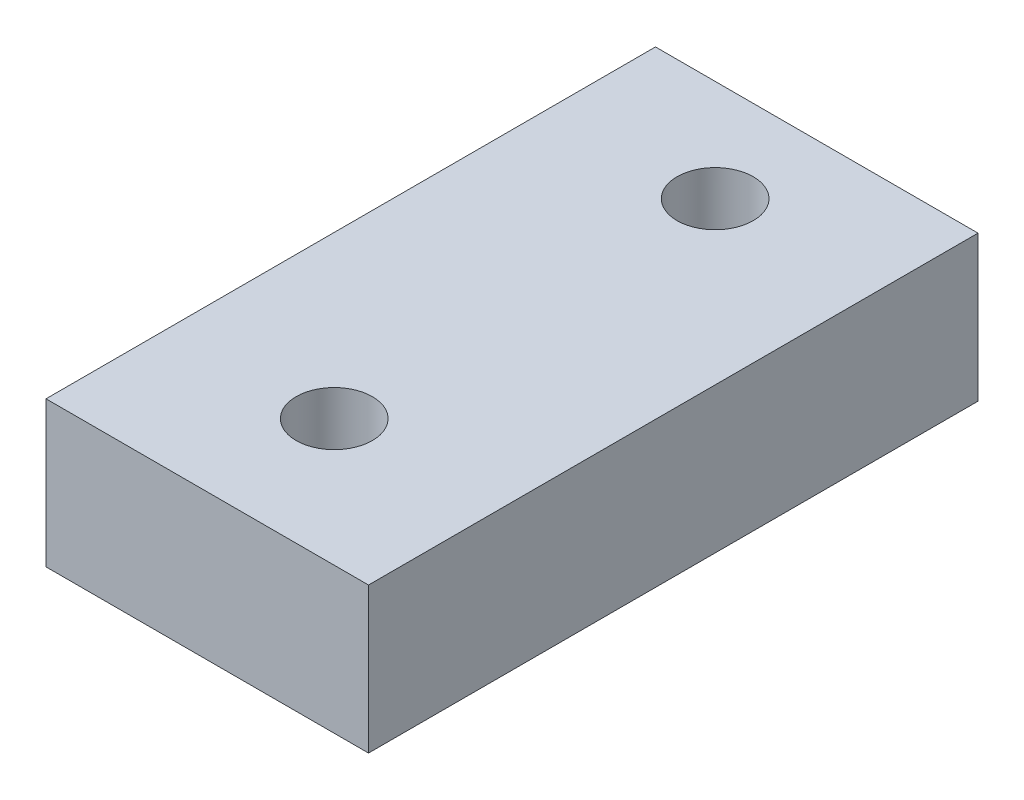
ISO-10303-21;
HEADER;
FILE_DESCRIPTION(('STEP AP214'),'2;1');
FILE_NAME('part.step','',(''),(''),'','','');
FILE_SCHEMA(('AUTOMOTIVE_DESIGN { 1 0 10303 214 1 1 1 1 }'));
ENDSEC;
DATA;
#1=APPLICATION_CONTEXT('core data for automotive mechanical design processes');
#2=APPLICATION_PROTOCOL_DEFINITION('international standard','automotive_design',2000,#1);
#3=PRODUCT_CONTEXT('',#1,'mechanical');
#4=PRODUCT('Part','Part','',(#3));
#5=PRODUCT_RELATED_PRODUCT_CATEGORY('part','',(#4));
#6=PRODUCT_DEFINITION_FORMATION('','',#4);
#7=PRODUCT_DEFINITION_CONTEXT('part definition',#1,'design');
#8=PRODUCT_DEFINITION('design','',#6,#7);
#9=PRODUCT_DEFINITION_SHAPE('','',#8);
#10=(LENGTH_UNIT() NAMED_UNIT(*) SI_UNIT(.MILLI.,.METRE.));
#11=(NAMED_UNIT(*) PLANE_ANGLE_UNIT() SI_UNIT($,.RADIAN.));
#12=(NAMED_UNIT(*) SI_UNIT($,.STERADIAN.) SOLID_ANGLE_UNIT());
#13=UNCERTAINTY_MEASURE_WITH_UNIT(LENGTH_MEASURE(1.E-05),#10,'distance_accuracy_value','');
#14=(GEOMETRIC_REPRESENTATION_CONTEXT(3) GLOBAL_UNCERTAINTY_ASSIGNED_CONTEXT((#13)) GLOBAL_UNIT_ASSIGNED_CONTEXT((#10,
#11,#12)) REPRESENTATION_CONTEXT('',''));
#15=CARTESIAN_POINT('',(0.,0.,0.));
#16=DIRECTION('',(0.,0.,1.));
#17=DIRECTION('',(1.,0.,0.));
#18=AXIS2_PLACEMENT_3D('',#15,#16,#17);
#19=CARTESIAN_POINT('',(-405.697007008209,-61.1760207457072,-701.165175873036));
#20=DIRECTION('',(0.,1.,0.));
#21=DIRECTION('',(-1.,0.,0.));
#22=AXIS2_PLACEMENT_3D('',#19,#20,#21);
#23=PLANE('',#22);
#24=CARTESIAN_POINT('',(55.9340563032146,-61.1760207457071,90.2538327003974));
#25=DIRECTION('',(0.,1.,0.));
#26=DIRECTION('',(0.,0.,-1.));
#27=AXIS2_PLACEMENT_3D('',#24,#25,#26);
#28=CIRCLE('',#27,1.49999999999995);
#29=CARTESIAN_POINT('',(55.9340563032146,-61.1760207457071,91.7538327003975));
#30=VERTEX_POINT('',#29);
#31=CARTESIAN_POINT('',(55.9340563032146,-61.1760207457071,88.7538327003975));
#32=VERTEX_POINT('',#31);
#33=EDGE_CURVE('E186',#30,#32,#28,.T.);
#34=ORIENTED_EDGE('',*,*,#33,.F.);
#35=CARTESIAN_POINT('',(55.9340563032146,-61.1760207457071,90.2538327003974));
#36=DIRECTION('',(0.,1.,0.));
#37=DIRECTION('',(0.,0.,-1.));
#38=AXIS2_PLACEMENT_3D('',#35,#36,#37);
#39=CIRCLE('',#38,1.49999999999995);
#40=EDGE_CURVE('E178',#32,#30,#39,.T.);
#41=ORIENTED_EDGE('',*,*,#40,.F.);
#42=EDGE_LOOP('',(#34,#41));
#43=FACE_BOUND('',#42,.T.);
#44=CARTESIAN_POINT('',(55.9340563032146,-61.1760207457074,105.253832700397));
#45=DIRECTION('',(0.,1.,0.));
#46=DIRECTION('',(0.,0.,-1.));
#47=AXIS2_PLACEMENT_3D('',#44,#45,#46);
#48=CIRCLE('',#47,1.49999999999995);
#49=CARTESIAN_POINT('',(55.9340563032146,-61.1760207457073,106.753832700398));
#50=VERTEX_POINT('',#49);
#51=CARTESIAN_POINT('',(55.9340563032146,-61.1760207457074,103.753832700398));
#52=VERTEX_POINT('',#51);
#53=EDGE_CURVE('E182',#50,#52,#48,.T.);
#54=ORIENTED_EDGE('',*,*,#53,.F.);
#55=CARTESIAN_POINT('',(55.9340563032146,-61.1760207457074,105.253832700397));
#56=DIRECTION('',(0.,1.,0.));
#57=DIRECTION('',(0.,0.,-1.));
#58=AXIS2_PLACEMENT_3D('',#55,#56,#57);
#59=CIRCLE('',#58,1.49999999999995);
#60=EDGE_CURVE('E154',#52,#50,#59,.T.);
#61=ORIENTED_EDGE('',*,*,#60,.F.);
#62=EDGE_LOOP('',(#54,#61));
#63=FACE_BOUND('',#62,.T.);
#64=DIRECTION('',(0.,0.,-1.));
#65=VECTOR('',#64,1.);
#66=CARTESIAN_POINT('',(49.5840563032139,-61.1760207457073,110.253832700397));
#67=LINE('',#66,#65);
#68=CARTESIAN_POINT('',(49.5840563032139,-61.1760207457073,110.253832700397));
#69=VERTEX_POINT('',#68);
#70=CARTESIAN_POINT('',(49.5840563032145,-61.1760207457073,86.2538327003975));
#71=VERTEX_POINT('',#70);
#72=EDGE_CURVE('E144',#69,#71,#67,.T.);
#73=ORIENTED_EDGE('',*,*,#72,.F.);
#74=DIRECTION('',(-1.,0.,0.));
#75=VECTOR('',#74,1.);
#76=CARTESIAN_POINT('',(62.2840563032145,-61.1760207457073,110.253832700397));
#77=LINE('',#76,#75);
#78=CARTESIAN_POINT('',(62.2840563032145,-61.1760207457073,110.253832700397));
#79=VERTEX_POINT('',#78);
#80=EDGE_CURVE('E140',#79,#69,#77,.T.);
#81=ORIENTED_EDGE('',*,*,#80,.F.);
#82=DIRECTION('',(0.,0.,1.));
#83=VECTOR('',#82,1.);
#84=CARTESIAN_POINT('',(62.2840563032145,-61.1760207457073,110.253832700397));
#85=LINE('',#84,#83);
#86=CARTESIAN_POINT('',(62.2840563032145,-61.1760207457073,86.2538327003975));
#87=VERTEX_POINT('',#86);
#88=EDGE_CURVE('E135',#87,#79,#85,.T.);
#89=ORIENTED_EDGE('',*,*,#88,.F.);
#90=DIRECTION('',(1.,0.,0.));
#91=VECTOR('',#90,1.);
#92=CARTESIAN_POINT('',(62.2840563032145,-61.1760207457073,86.2538327003975));
#93=LINE('',#92,#91);
#94=EDGE_CURVE('E150',#71,#87,#93,.T.);
#95=ORIENTED_EDGE('',*,*,#94,.F.);
#96=EDGE_LOOP('',(#73,#81,#89,#95));
#97=FACE_BOUND('',#96,.T.);
#98=ADVANCED_FACE('F73',(#43,#63,#97),#23,.T.);
#99=CARTESIAN_POINT('',(62.2840563032145,-48.4740207457073,110.253832700397));
#100=DIRECTION('',(0.,0.,1.));
#101=DIRECTION('',(1.,0.,0.));
#102=AXIS2_PLACEMENT_3D('',#99,#100,#101);
#103=PLANE('',#102);
#104=DIRECTION('',(0.,-1.,0.));
#105=VECTOR('',#104,1.);
#106=CARTESIAN_POINT('',(62.2840563032145,-48.4740207457073,110.253832700397));
#107=LINE('',#106,#105);
#108=CARTESIAN_POINT('',(62.2840563032145,-66.9078516179254,110.253832700397));
#109=VERTEX_POINT('',#108);
#110=EDGE_CURVE('E90',#79,#109,#107,.T.);
#111=ORIENTED_EDGE('',*,*,#110,.F.);
#112=ORIENTED_EDGE('',*,*,#80,.T.);
#113=DIRECTION('',(0.,-1.,0.));
#114=VECTOR('',#113,1.);
#115=CARTESIAN_POINT('',(49.5840563032139,-48.4740207457073,110.253832700397));
#116=LINE('',#115,#114);
#117=CARTESIAN_POINT('',(49.5840563032139,-66.9078516179254,110.253832700397));
#118=VERTEX_POINT('',#117);
#119=EDGE_CURVE('E97',#69,#118,#116,.T.);
#120=ORIENTED_EDGE('',*,*,#119,.T.);
#121=DIRECTION('',(-1.,0.,0.));
#122=VECTOR('',#121,1.);
#123=CARTESIAN_POINT('',(62.2840563032145,-66.9078516179254,110.253832700397));
#124=LINE('',#123,#122);
#125=EDGE_CURVE('E149',#109,#118,#124,.T.);
#126=ORIENTED_EDGE('',*,*,#125,.F.);
#127=EDGE_LOOP('',(#111,#112,#120,#126));
#128=FACE_BOUND('',#127,.T.);
#129=ADVANCED_FACE('F147',(#128),#103,.T.);
#130=CARTESIAN_POINT('',(0.,-66.9078516179254,0.));
#131=DIRECTION('',(0.,1.,0.));
#132=DIRECTION('',(0.,0.,1.));
#133=AXIS2_PLACEMENT_3D('',#130,#131,#132);
#134=PLANE('',#133);
#135=CARTESIAN_POINT('',(55.9340563032146,-66.9078516179254,105.253832700397));
#136=DIRECTION('',(0.,-1.,0.));
#137=DIRECTION('',(0.,0.,-1.));
#138=AXIS2_PLACEMENT_3D('',#135,#136,#137);
#139=CIRCLE('',#138,1.5);
#140=CARTESIAN_POINT('',(55.9340563032146,-66.9078516179254,103.753832700397));
#141=VERTEX_POINT('',#140);
#142=EDGE_CURVE('E157',#141,#141,#139,.T.);
#143=ORIENTED_EDGE('',*,*,#142,.F.);
#144=EDGE_LOOP('',(#143));
#145=FACE_BOUND('',#144,.T.);
#146=CARTESIAN_POINT('',(55.9340563032146,-66.9078516179254,90.2538327003974));
#147=DIRECTION('',(0.,-1.,0.));
#148=DIRECTION('',(0.,0.,-1.));
#149=AXIS2_PLACEMENT_3D('',#146,#147,#148);
#150=CIRCLE('',#149,1.5);
#151=CARTESIAN_POINT('',(55.9340563032146,-66.9078516179254,88.7538327003974));
#152=VERTEX_POINT('',#151);
#153=EDGE_CURVE('E165',#152,#152,#150,.T.);
#154=ORIENTED_EDGE('',*,*,#153,.F.);
#155=EDGE_LOOP('',(#154));
#156=FACE_BOUND('',#155,.T.);
#157=DIRECTION('',(0.,0.,1.));
#158=VECTOR('',#157,1.);
#159=CARTESIAN_POINT('',(62.2840563032145,-66.9078516179254,110.253832700397));
#160=LINE('',#159,#158);
#161=CARTESIAN_POINT('',(62.2840563032145,-66.9078516179254,86.2538327003975));
#162=VERTEX_POINT('',#161);
#163=EDGE_CURVE('E12',#162,#109,#160,.T.);
#164=ORIENTED_EDGE('',*,*,#163,.T.);
#165=ORIENTED_EDGE('',*,*,#125,.T.);
#166=DIRECTION('',(0.,0.,-1.));
#167=VECTOR('',#166,1.);
#168=CARTESIAN_POINT('',(49.5840563032139,-66.9078516179254,110.253832700397));
#169=LINE('',#168,#167);
#170=CARTESIAN_POINT('',(49.5840563032145,-66.9078516179254,86.2538327003975));
#171=VERTEX_POINT('',#170);
#172=EDGE_CURVE('E171',#118,#171,#169,.T.);
#173=ORIENTED_EDGE('',*,*,#172,.T.);
#174=DIRECTION('',(1.,0.,0.));
#175=VECTOR('',#174,1.);
#176=CARTESIAN_POINT('',(62.2840563032145,-66.9078516179254,86.2538327003975));
#177=LINE('',#176,#175);
#178=EDGE_CURVE('E82',#171,#162,#177,.T.);
#179=ORIENTED_EDGE('',*,*,#178,.T.);
#180=EDGE_LOOP('',(#164,#165,#173,#179));
#181=FACE_BOUND('',#180,.T.);
#182=ADVANCED_FACE('F214',(#145,#156,#181),#134,.F.);
#183=CARTESIAN_POINT('',(62.2840563032145,-48.4740207457073,110.253832700397));
#184=DIRECTION('',(1.,0.,0.));
#185=DIRECTION('',(0.,0.,-1.));
#186=AXIS2_PLACEMENT_3D('',#183,#184,#185);
#187=PLANE('',#186);
#188=DIRECTION('',(0.,-1.,0.));
#189=VECTOR('',#188,1.);
#190=CARTESIAN_POINT('',(62.2840563032145,-48.4740207457073,86.2538327003975));
#191=LINE('',#190,#189);
#192=EDGE_CURVE('E77',#87,#162,#191,.T.);
#193=ORIENTED_EDGE('',*,*,#192,.F.);
#194=ORIENTED_EDGE('',*,*,#88,.T.);
#195=ORIENTED_EDGE('',*,*,#110,.T.);
#196=ORIENTED_EDGE('',*,*,#163,.F.);
#197=EDGE_LOOP('',(#193,#194,#195,#196));
#198=FACE_BOUND('',#197,.T.);
#199=ADVANCED_FACE('F137',(#198),#187,.T.);
#200=CARTESIAN_POINT('',(49.5840563032139,-48.4740207457073,110.253832700397));
#201=DIRECTION('',(-1.,0.,0.));
#202=DIRECTION('',(0.,0.,1.));
#203=AXIS2_PLACEMENT_3D('',#200,#201,#202);
#204=PLANE('',#203);
#205=ORIENTED_EDGE('',*,*,#119,.F.);
#206=ORIENTED_EDGE('',*,*,#72,.T.);
#207=DIRECTION('',(0.,-1.,0.));
#208=VECTOR('',#207,1.);
#209=CARTESIAN_POINT('',(49.5840563032145,-48.4740207457073,86.2538327003975));
#210=LINE('',#209,#208);
#211=EDGE_CURVE('E152',#71,#171,#210,.T.);
#212=ORIENTED_EDGE('',*,*,#211,.T.);
#213=ORIENTED_EDGE('',*,*,#172,.F.);
#214=EDGE_LOOP('',(#205,#206,#212,#213));
#215=FACE_BOUND('',#214,.T.);
#216=ADVANCED_FACE('F207',(#215),#204,.T.);
#217=CARTESIAN_POINT('',(62.2840563032145,-48.4740207457073,86.2538327003975));
#218=DIRECTION('',(0.,0.,-1.));
#219=DIRECTION('',(-1.,0.,0.));
#220=AXIS2_PLACEMENT_3D('',#217,#218,#219);
#221=PLANE('',#220);
#222=ORIENTED_EDGE('',*,*,#211,.F.);
#223=ORIENTED_EDGE('',*,*,#94,.T.);
#224=ORIENTED_EDGE('',*,*,#192,.T.);
#225=ORIENTED_EDGE('',*,*,#178,.F.);
#226=EDGE_LOOP('',(#222,#223,#224,#225));
#227=FACE_BOUND('',#226,.T.);
#228=ADVANCED_FACE('F202',(#227),#221,.T.);
#229=CARTESIAN_POINT('',(55.9340563032146,-48.4740207457073,105.253832700397));
#230=DIRECTION('',(0.,-1.,0.));
#231=DIRECTION('',(0.,0.,-1.));
#232=AXIS2_PLACEMENT_3D('',#229,#230,#231);
#233=CYLINDRICAL_SURFACE('',#232,1.5);
#234=ORIENTED_EDGE('',*,*,#60,.T.);
#235=ORIENTED_EDGE('',*,*,#53,.T.);
#236=EDGE_LOOP('',(#234,#235));
#237=FACE_BOUND('',#236,.T.);
#238=ORIENTED_EDGE('',*,*,#142,.T.);
#239=EDGE_LOOP('',(#238));
#240=FACE_BOUND('',#239,.T.);
#241=ADVANCED_FACE('F200',(#237,#240),#233,.F.);
#242=CARTESIAN_POINT('',(55.9340563032146,-48.4740207457073,90.2538327003974));
#243=DIRECTION('',(0.,-1.,0.));
#244=DIRECTION('',(0.,0.,-1.));
#245=AXIS2_PLACEMENT_3D('',#242,#243,#244);
#246=CYLINDRICAL_SURFACE('',#245,1.5);
#247=ORIENTED_EDGE('',*,*,#153,.T.);
#248=EDGE_LOOP('',(#247));
#249=FACE_BOUND('',#248,.T.);
#250=ORIENTED_EDGE('',*,*,#33,.T.);
#251=ORIENTED_EDGE('',*,*,#40,.T.);
#252=EDGE_LOOP('',(#250,#251));
#253=FACE_BOUND('',#252,.T.);
#254=ADVANCED_FACE('F75',(#249,#253),#246,.F.);
#255=CLOSED_SHELL('',(#98,#129,#182,#199,#216,#228,#241,#254));
#256=MANIFOLD_SOLID_BREP('B2',#255);
#257=ADVANCED_BREP_SHAPE_REPRESENTATION('',(#18,#256),#14);
#258=SHAPE_DEFINITION_REPRESENTATION(#9,#257);
ENDSEC;
END-ISO-10303-21;
